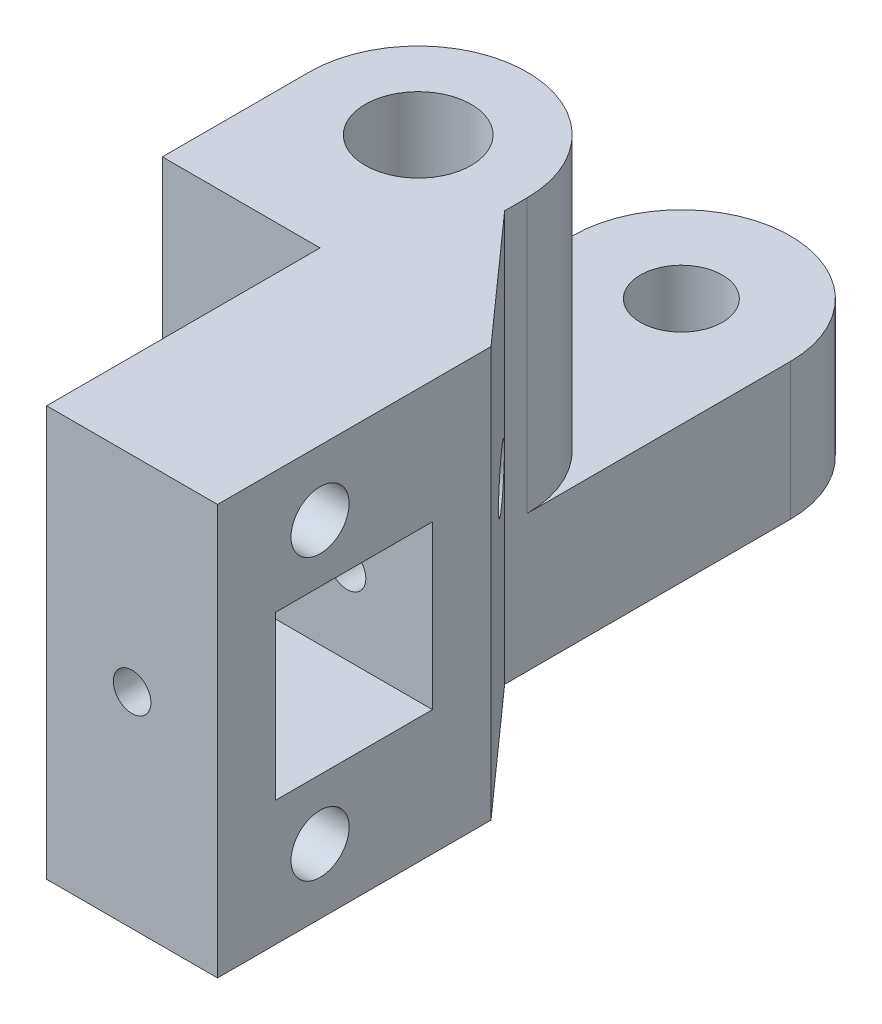
ISO-10303-21;
HEADER;
FILE_DESCRIPTION(('STEP AP214'),'2;1');
FILE_NAME('part.step','',(''),(''),'','','');
FILE_SCHEMA(('AUTOMOTIVE_DESIGN { 1 0 10303 214 1 1 1 1 }'));
ENDSEC;
DATA;
#1=APPLICATION_CONTEXT('core data for automotive mechanical design processes');
#2=APPLICATION_PROTOCOL_DEFINITION('international standard','automotive_design',2000,#1);
#3=PRODUCT_CONTEXT('',#1,'mechanical');
#4=PRODUCT('Part','Part','',(#3));
#5=PRODUCT_RELATED_PRODUCT_CATEGORY('part','',(#4));
#6=PRODUCT_DEFINITION_FORMATION('','',#4);
#7=PRODUCT_DEFINITION_CONTEXT('part definition',#1,'design');
#8=PRODUCT_DEFINITION('design','',#6,#7);
#9=PRODUCT_DEFINITION_SHAPE('','',#8);
#10=(LENGTH_UNIT() NAMED_UNIT(*) SI_UNIT(.MILLI.,.METRE.));
#11=(NAMED_UNIT(*) PLANE_ANGLE_UNIT() SI_UNIT($,.RADIAN.));
#12=(NAMED_UNIT(*) SI_UNIT($,.STERADIAN.) SOLID_ANGLE_UNIT());
#13=UNCERTAINTY_MEASURE_WITH_UNIT(LENGTH_MEASURE(1.E-05),#10,'distance_accuracy_value','');
#14=(GEOMETRIC_REPRESENTATION_CONTEXT(3) GLOBAL_UNCERTAINTY_ASSIGNED_CONTEXT((#13)) GLOBAL_UNIT_ASSIGNED_CONTEXT((#10,
#11,#12)) REPRESENTATION_CONTEXT('',''));
#15=CARTESIAN_POINT('',(0.,0.,0.));
#16=DIRECTION('',(0.,0.,1.));
#17=DIRECTION('',(1.,0.,0.));
#18=AXIS2_PLACEMENT_3D('',#15,#16,#17);
#19=CARTESIAN_POINT('',(198.249144514163,-50.,43.8148168537435));
#20=DIRECTION('',(0.,0.,-1.));
#21=DIRECTION('',(-1.,0.,0.));
#22=AXIS2_PLACEMENT_3D('',#19,#20,#21);
#23=PLANE('',#22);
#24=DIRECTION('',(0.,-1.,0.));
#25=VECTOR('',#24,1.);
#26=CARTESIAN_POINT('',(189.459181509734,60.,43.8148168537436));
#27=LINE('',#26,#25);
#28=CARTESIAN_POINT('',(189.459181509734,60.,43.8148168537435));
#29=VERTEX_POINT('',#28);
#30=CARTESIAN_POINT('',(189.459181509734,0.,43.8148168537436));
#31=VERTEX_POINT('',#30);
#32=EDGE_CURVE('E185',#29,#31,#27,.T.);
#33=ORIENTED_EDGE('',*,*,#32,.F.);
#34=DIRECTION('',(-1.,0.,0.));
#35=VECTOR('',#34,1.);
#36=CARTESIAN_POINT('',(198.249144514163,60.,43.8148168537435));
#37=LINE('',#36,#35);
#38=CARTESIAN_POINT('',(166.38327549447,60.,43.8148168537435));
#39=VERTEX_POINT('',#38);
#40=EDGE_CURVE('E212',#29,#39,#37,.T.);
#41=ORIENTED_EDGE('',*,*,#40,.T.);
#42=DIRECTION('',(0.,1.,0.));
#43=VECTOR('',#42,1.);
#44=CARTESIAN_POINT('',(166.38327549447,-50.,43.8148168537435));
#45=LINE('',#44,#43);
#46=CARTESIAN_POINT('',(166.38327549447,0.,43.8148168537435));
#47=VERTEX_POINT('',#46);
#48=EDGE_CURVE('E214',#47,#39,#45,.T.);
#49=ORIENTED_EDGE('',*,*,#48,.F.);
#50=DIRECTION('',(1.,0.,0.));
#51=VECTOR('',#50,1.);
#52=CARTESIAN_POINT('',(182.316210004317,0.,43.8148168537435));
#53=LINE('',#52,#51);
#54=EDGE_CURVE('E217',#47,#31,#53,.T.);
#55=ORIENTED_EDGE('',*,*,#54,.T.);
#56=EDGE_LOOP('',(#33,#41,#49,#55));
#57=FACE_BOUND('',#56,.T.);
#58=ADVANCED_FACE('F35',(#57),#23,.F.);
#59=CARTESIAN_POINT('',(166.38327549447,60.,83.8148168537435));
#60=DIRECTION('',(1.,0.,0.));
#61=DIRECTION('',(0.,0.,1.));
#62=AXIS2_PLACEMENT_3D('',#59,#60,#61);
#63=PLANE('',#62);
#64=DIRECTION('',(0.,0.,-1.));
#65=VECTOR('',#64,1.);
#66=CARTESIAN_POINT('',(166.38327549447,0.,83.8148168537435));
#67=LINE('',#66,#65);
#68=CARTESIAN_POINT('',(166.38327549447,0.,-16.1851831462565));
#69=VERTEX_POINT('',#68);
#70=EDGE_CURVE('E253',#47,#69,#67,.T.);
#71=ORIENTED_EDGE('',*,*,#70,.F.);
#72=ORIENTED_EDGE('',*,*,#48,.T.);
#73=DIRECTION('',(0.,0.,-1.));
#74=VECTOR('',#73,1.);
#75=CARTESIAN_POINT('',(166.38327549447,60.,83.8148168537435));
#76=LINE('',#75,#74);
#77=CARTESIAN_POINT('',(166.38327549447,60.,22.3148168537435));
#78=VERTEX_POINT('',#77);
#79=EDGE_CURVE('E252',#39,#78,#76,.T.);
#80=ORIENTED_EDGE('',*,*,#79,.T.);
#81=DIRECTION('',(0.,1.,0.));
#82=VECTOR('',#81,1.);
#83=CARTESIAN_POINT('',(166.38327549447,20.,22.3148168537435));
#84=LINE('',#83,#82);
#85=CARTESIAN_POINT('',(166.38327549447,20.,22.3148168537435));
#86=VERTEX_POINT('',#85);
#87=EDGE_CURVE('E231',#86,#78,#84,.T.);
#88=ORIENTED_EDGE('',*,*,#87,.F.);
#89=DIRECTION('',(0.,0.,-1.));
#90=VECTOR('',#89,1.);
#91=CARTESIAN_POINT('',(166.38327549447,20.,-16.1851831462565));
#92=LINE('',#91,#90);
#93=CARTESIAN_POINT('',(166.38327549447,20.,-16.1851831462565));
#94=VERTEX_POINT('',#93);
#95=EDGE_CURVE('E225',#86,#94,#92,.T.);
#96=ORIENTED_EDGE('',*,*,#95,.T.);
#97=DIRECTION('',(0.,-1.,0.));
#98=VECTOR('',#97,1.);
#99=CARTESIAN_POINT('',(166.38327549447,60.,-16.1851831462565));
#100=LINE('',#99,#98);
#101=EDGE_CURVE('E44',#94,#69,#100,.T.);
#102=ORIENTED_EDGE('',*,*,#101,.T.);
#103=EDGE_LOOP('',(#71,#72,#80,#88,#96,#102));
#104=FACE_BOUND('',#103,.T.);
#105=ADVANCED_FACE('F322',(#104),#63,.F.);
#106=CARTESIAN_POINT('',(182.316210004317,60.,-16.1851831462565));
#107=DIRECTION('',(0.,-1.,0.));
#108=DIRECTION('',(0.,0.,-1.));
#109=AXIS2_PLACEMENT_3D('',#106,#107,#108);
#110=CYLINDRICAL_SURFACE('',#109,15.9329345098463);
#111=CARTESIAN_POINT('',(182.316210004317,20.,-16.1851831462565));
#112=DIRECTION('',(0.,-1.,0.));
#113=DIRECTION('',(0.,0.,1.));
#114=AXIS2_PLACEMENT_3D('',#111,#112,#113);
#115=CIRCLE('',#114,15.9329345098463);
#116=CARTESIAN_POINT('',(198.249144514163,20.,-16.1851831462565));
#117=VERTEX_POINT('',#116);
#118=EDGE_CURVE('E234',#94,#117,#115,.T.);
#119=ORIENTED_EDGE('',*,*,#118,.T.);
#120=DIRECTION('',(0.,-1.,0.));
#121=VECTOR('',#120,1.);
#122=CARTESIAN_POINT('',(198.249144514163,60.,-16.1851831462565));
#123=LINE('',#122,#121);
#124=CARTESIAN_POINT('',(198.249144514163,0.,-16.1851831462565));
#125=VERTEX_POINT('',#124);
#126=EDGE_CURVE('E11',#117,#125,#123,.T.);
#127=ORIENTED_EDGE('',*,*,#126,.T.);
#128=CARTESIAN_POINT('',(182.316210004317,0.,-16.1851831462565));
#129=DIRECTION('',(0.,-1.,0.));
#130=DIRECTION('',(0.,0.,-1.));
#131=AXIS2_PLACEMENT_3D('',#128,#129,#130);
#132=CIRCLE('',#131,15.9329345098463);
#133=EDGE_CURVE('E248',#69,#125,#132,.T.);
#134=ORIENTED_EDGE('',*,*,#133,.F.);
#135=ORIENTED_EDGE('',*,*,#101,.F.);
#136=EDGE_LOOP('',(#119,#127,#134,#135));
#137=FACE_BOUND('',#136,.T.);
#138=ADVANCED_FACE('F37',(#137),#110,.T.);
#139=CARTESIAN_POINT('',(182.316210004317,60.,-16.1851831462565));
#140=DIRECTION('',(0.,-1.,0.));
#141=DIRECTION('',(0.,0.,-1.));
#142=AXIS2_PLACEMENT_3D('',#139,#140,#141);
#143=CYLINDRICAL_SURFACE('',#142,6.);
#144=CARTESIAN_POINT('',(182.316210004317,0.,-16.1851831462565));
#145=DIRECTION('',(0.,-1.,0.));
#146=DIRECTION('',(0.,0.,1.));
#147=AXIS2_PLACEMENT_3D('',#144,#145,#146);
#148=CIRCLE('',#147,6.);
#149=CARTESIAN_POINT('',(182.316210004317,0.,-10.1851831462565));
#150=VERTEX_POINT('',#149);
#151=EDGE_CURVE('E242',#150,#150,#148,.T.);
#152=ORIENTED_EDGE('',*,*,#151,.T.);
#153=EDGE_LOOP('',(#152));
#154=FACE_BOUND('',#153,.T.);
#155=CARTESIAN_POINT('',(182.316210004317,20.,-16.1851831462565));
#156=DIRECTION('',(0.,-1.,0.));
#157=DIRECTION('',(0.,0.,1.));
#158=AXIS2_PLACEMENT_3D('',#155,#156,#157);
#159=CIRCLE('',#158,6.);
#160=CARTESIAN_POINT('',(182.316210004317,20.,-10.1851831462565));
#161=VERTEX_POINT('',#160);
#162=EDGE_CURVE('E238',#161,#161,#159,.T.);
#163=ORIENTED_EDGE('',*,*,#162,.F.);
#164=EDGE_LOOP('',(#163));
#165=FACE_BOUND('',#164,.T.);
#166=ADVANCED_FACE('F347',(#154,#165),#143,.F.);
#167=CARTESIAN_POINT('',(182.316210004317,60.,-16.1851831462565));
#168=DIRECTION('',(0.,-1.,0.));
#169=DIRECTION('',(0.,0.,-1.));
#170=AXIS2_PLACEMENT_3D('',#167,#168,#169);
#171=PLANE('',#170);
#172=ORIENTED_EDGE('',*,*,#79,.F.);
#173=ORIENTED_EDGE('',*,*,#40,.F.);
#174=DIRECTION('',(0.,0.,-1.));
#175=VECTOR('',#174,1.);
#176=CARTESIAN_POINT('',(189.459181509734,60.,83.8148168537436));
#177=LINE('',#176,#175);
#178=CARTESIAN_POINT('',(189.459181509734,60.,83.8148168537436));
#179=VERTEX_POINT('',#178);
#180=EDGE_CURVE('E196',#179,#29,#177,.T.);
#181=ORIENTED_EDGE('',*,*,#180,.F.);
#182=DIRECTION('',(-1.,0.,0.));
#183=VECTOR('',#182,1.);
#184=CARTESIAN_POINT('',(189.459181509734,60.,83.8148168537436));
#185=LINE('',#184,#183);
#186=CARTESIAN_POINT('',(214.459181509734,60.,83.8148168537436));
#187=VERTEX_POINT('',#186);
#188=EDGE_CURVE('E194',#187,#179,#185,.T.);
#189=ORIENTED_EDGE('',*,*,#188,.F.);
#190=DIRECTION('',(0.,0.,-1.));
#191=VECTOR('',#190,1.);
#192=CARTESIAN_POINT('',(214.459181509734,60.,83.8148168537436));
#193=LINE('',#192,#191);
#194=CARTESIAN_POINT('',(214.459181509734,60.,43.8148168537436));
#195=VERTEX_POINT('',#194);
#196=EDGE_CURVE('E203',#187,#195,#193,.T.);
#197=ORIENTED_EDGE('',*,*,#196,.T.);
#198=DIRECTION('',(-0.664899161094069,0.,-0.746933133269908));
#199=VECTOR('',#198,1.);
#200=CARTESIAN_POINT('',(198.249144514163,60.,25.6048168537435));
#201=LINE('',#200,#199);
#202=CARTESIAN_POINT('',(198.249144514163,60.,25.6048168537435));
#203=VERTEX_POINT('',#202);
#204=EDGE_CURVE('E175',#195,#203,#201,.T.);
#205=ORIENTED_EDGE('',*,*,#204,.T.);
#206=DIRECTION('',(0.,0.,1.));
#207=VECTOR('',#206,1.);
#208=CARTESIAN_POINT('',(198.249144514163,60.,-16.1851831462565));
#209=LINE('',#208,#207);
#210=CARTESIAN_POINT('',(198.249144514163,60.,22.3148168537435));
#211=VERTEX_POINT('',#210);
#212=EDGE_CURVE('E249',#211,#203,#209,.T.);
#213=ORIENTED_EDGE('',*,*,#212,.F.);
#214=CARTESIAN_POINT('',(182.316210004317,60.,22.3148168537435));
#215=DIRECTION('',(0.,1.,0.));
#216=DIRECTION('',(0.,0.,1.));
#217=AXIS2_PLACEMENT_3D('',#214,#215,#216);
#218=CIRCLE('',#217,15.9329345098463);
#219=EDGE_CURVE('E219',#211,#78,#218,.T.);
#220=ORIENTED_EDGE('',*,*,#219,.T.);
#221=EDGE_LOOP('',(#172,#173,#181,#189,#197,#205,#213,#220));
#222=FACE_BOUND('',#221,.T.);
#223=CARTESIAN_POINT('',(182.316210004317,60.,22.3148168537435));
#224=DIRECTION('',(0.,-1.,0.));
#225=DIRECTION('',(0.,0.,1.));
#226=AXIS2_PLACEMENT_3D('',#223,#224,#225);
#227=CIRCLE('',#226,7.75);
#228=CARTESIAN_POINT('',(182.316210004317,60.,30.0648168537435));
#229=VERTEX_POINT('',#228);
#230=EDGE_CURVE('E239',#229,#229,#227,.T.);
#231=ORIENTED_EDGE('',*,*,#230,.T.);
#232=EDGE_LOOP('',(#231));
#233=FACE_BOUND('',#232,.T.);
#234=ADVANCED_FACE('F314',(#222,#233),#171,.F.);
#235=CARTESIAN_POINT('',(182.316210004317,0.,-16.1851831462565));
#236=DIRECTION('',(0.,-1.,0.));
#237=DIRECTION('',(0.,0.,-1.));
#238=AXIS2_PLACEMENT_3D('',#235,#236,#237);
#239=PLANE('',#238);
#240=ORIENTED_EDGE('',*,*,#54,.F.);
#241=ORIENTED_EDGE('',*,*,#70,.T.);
#242=ORIENTED_EDGE('',*,*,#133,.T.);
#243=DIRECTION('',(0.,0.,1.));
#244=VECTOR('',#243,1.);
#245=CARTESIAN_POINT('',(198.249144514163,0.,-16.1851831462565));
#246=LINE('',#245,#244);
#247=CARTESIAN_POINT('',(198.249144514163,0.,25.6048168537435));
#248=VERTEX_POINT('',#247);
#249=EDGE_CURVE('E257',#125,#248,#246,.T.);
#250=ORIENTED_EDGE('',*,*,#249,.T.);
#251=DIRECTION('',(-0.664899161094069,0.,-0.746933133269908));
#252=VECTOR('',#251,1.);
#253=CARTESIAN_POINT('',(198.249144514163,0.,25.6048168537435));
#254=LINE('',#253,#252);
#255=CARTESIAN_POINT('',(214.459181509734,0.,43.8148168537436));
#256=VERTEX_POINT('',#255);
#257=EDGE_CURVE('E179',#256,#248,#254,.T.);
#258=ORIENTED_EDGE('',*,*,#257,.F.);
#259=DIRECTION('',(0.,0.,-1.));
#260=VECTOR('',#259,1.);
#261=CARTESIAN_POINT('',(214.459181509734,0.,83.8148168537436));
#262=LINE('',#261,#260);
#263=CARTESIAN_POINT('',(214.459181509734,0.,83.8148168537436));
#264=VERTEX_POINT('',#263);
#265=EDGE_CURVE('E206',#264,#256,#262,.T.);
#266=ORIENTED_EDGE('',*,*,#265,.F.);
#267=DIRECTION('',(1.,0.,0.));
#268=VECTOR('',#267,1.);
#269=CARTESIAN_POINT('',(189.459181509734,0.,83.8148168537436));
#270=LINE('',#269,#268);
#271=CARTESIAN_POINT('',(189.459181509734,0.,83.8148168537436));
#272=VERTEX_POINT('',#271);
#273=EDGE_CURVE('E189',#272,#264,#270,.T.);
#274=ORIENTED_EDGE('',*,*,#273,.F.);
#275=DIRECTION('',(0.,0.,-1.));
#276=VECTOR('',#275,1.);
#277=CARTESIAN_POINT('',(189.459181509734,0.,83.8148168537436));
#278=LINE('',#277,#276);
#279=EDGE_CURVE('E209',#272,#31,#278,.T.);
#280=ORIENTED_EDGE('',*,*,#279,.T.);
#281=EDGE_LOOP('',(#240,#241,#242,#250,#258,#266,#274,#280));
#282=FACE_BOUND('',#281,.T.);
#283=ORIENTED_EDGE('',*,*,#151,.F.);
#284=EDGE_LOOP('',(#283));
#285=FACE_BOUND('',#284,.T.);
#286=CARTESIAN_POINT('',(182.316210004317,0.,22.3148168537435));
#287=DIRECTION('',(0.,-1.,0.));
#288=DIRECTION('',(0.,0.,1.));
#289=AXIS2_PLACEMENT_3D('',#286,#287,#288);
#290=CIRCLE('',#289,7.75);
#291=CARTESIAN_POINT('',(182.316210004317,0.,30.0648168537435));
#292=VERTEX_POINT('',#291);
#293=EDGE_CURVE('E243',#292,#292,#290,.T.);
#294=ORIENTED_EDGE('',*,*,#293,.F.);
#295=EDGE_LOOP('',(#294));
#296=FACE_BOUND('',#295,.T.);
#297=ADVANCED_FACE('F324',(#282,#285,#296),#239,.T.);
#298=CARTESIAN_POINT('',(198.249144514163,60.,-16.1851831462565));
#299=DIRECTION('',(-1.,0.,0.));
#300=DIRECTION('',(0.,0.,-1.));
#301=AXIS2_PLACEMENT_3D('',#298,#299,#300);
#302=PLANE('',#301);
#303=ORIENTED_EDGE('',*,*,#212,.T.);
#304=DIRECTION('',(0.,1.,0.));
#305=VECTOR('',#304,1.);
#306=CARTESIAN_POINT('',(198.249144514163,0.,25.6048168537435));
#307=LINE('',#306,#305);
#308=EDGE_CURVE('E181',#248,#203,#307,.T.);
#309=ORIENTED_EDGE('',*,*,#308,.F.);
#310=ORIENTED_EDGE('',*,*,#249,.F.);
#311=ORIENTED_EDGE('',*,*,#126,.F.);
#312=DIRECTION('',(0.,0.,1.));
#313=VECTOR('',#312,1.);
#314=CARTESIAN_POINT('',(198.249144514163,20.,-16.1851831462565));
#315=LINE('',#314,#313);
#316=CARTESIAN_POINT('',(198.249144514163,20.,22.3148168537435));
#317=VERTEX_POINT('',#316);
#318=EDGE_CURVE('E220',#117,#317,#315,.T.);
#319=ORIENTED_EDGE('',*,*,#318,.T.);
#320=DIRECTION('',(0.,1.,0.));
#321=VECTOR('',#320,1.);
#322=CARTESIAN_POINT('',(198.249144514163,20.,22.3148168537435));
#323=LINE('',#322,#321);
#324=EDGE_CURVE('E228',#317,#211,#323,.T.);
#325=ORIENTED_EDGE('',*,*,#324,.T.);
#326=EDGE_LOOP('',(#303,#309,#310,#311,#319,#325));
#327=FACE_BOUND('',#326,.T.);
#328=ADVANCED_FACE('F338',(#327),#302,.F.);
#329=CARTESIAN_POINT('',(182.316210004317,60.,22.3148168537435));
#330=DIRECTION('',(0.,-1.,0.));
#331=DIRECTION('',(0.,0.,-1.));
#332=AXIS2_PLACEMENT_3D('',#329,#330,#331);
#333=CYLINDRICAL_SURFACE('',#332,7.75);
#334=ORIENTED_EDGE('',*,*,#230,.F.);
#335=EDGE_LOOP('',(#334));
#336=FACE_BOUND('',#335,.T.);
#337=ORIENTED_EDGE('',*,*,#293,.T.);
#338=EDGE_LOOP('',(#337));
#339=FACE_BOUND('',#338,.T.);
#340=ADVANCED_FACE('F365',(#336,#339),#333,.F.);
#341=CARTESIAN_POINT('',(182.316210004317,20.,-16.1851831462565));
#342=DIRECTION('',(0.,1.,0.));
#343=DIRECTION('',(0.,0.,1.));
#344=AXIS2_PLACEMENT_3D('',#341,#342,#343);
#345=PLANE('',#344);
#346=ORIENTED_EDGE('',*,*,#162,.T.);
#347=EDGE_LOOP('',(#346));
#348=FACE_BOUND('',#347,.T.);
#349=ORIENTED_EDGE('',*,*,#118,.F.);
#350=ORIENTED_EDGE('',*,*,#95,.F.);
#351=CARTESIAN_POINT('',(182.316210004317,20.,22.3148168537435));
#352=DIRECTION('',(0.,1.,0.));
#353=DIRECTION('',(0.,0.,1.));
#354=AXIS2_PLACEMENT_3D('',#351,#352,#353);
#355=CIRCLE('',#354,15.9329345098463);
#356=EDGE_CURVE('E223',#317,#86,#355,.T.);
#357=ORIENTED_EDGE('',*,*,#356,.F.);
#358=ORIENTED_EDGE('',*,*,#318,.F.);
#359=EDGE_LOOP('',(#349,#350,#357,#358));
#360=FACE_BOUND('',#359,.T.);
#361=ADVANCED_FACE('F343',(#348,#360),#345,.T.);
#362=CARTESIAN_POINT('',(182.316210004317,20.,22.3148168537435));
#363=DIRECTION('',(0.,1.,0.));
#364=DIRECTION('',(0.,0.,1.));
#365=AXIS2_PLACEMENT_3D('',#362,#363,#364);
#366=CYLINDRICAL_SURFACE('',#365,15.9329345098463);
#367=ORIENTED_EDGE('',*,*,#219,.F.);
#368=ORIENTED_EDGE('',*,*,#324,.F.);
#369=ORIENTED_EDGE('',*,*,#356,.T.);
#370=ORIENTED_EDGE('',*,*,#87,.T.);
#371=EDGE_LOOP('',(#367,#368,#369,#370));
#372=FACE_BOUND('',#371,.T.);
#373=ADVANCED_FACE('F300',(#372),#366,.T.);
#374=CARTESIAN_POINT('',(189.459181509734,60.,83.8148168537436));
#375=DIRECTION('',(1.,0.,0.));
#376=DIRECTION('',(0.,0.,-1.));
#377=AXIS2_PLACEMENT_3D('',#374,#375,#376);
#378=PLANE('',#377);
#379=CARTESIAN_POINT('',(189.459181509734,50.5000000000053,68.8148168537502));
#380=DIRECTION('',(-1.,0.,0.));
#381=DIRECTION('',(0.,0.,1.));
#382=AXIS2_PLACEMENT_3D('',#379,#380,#381);
#383=CIRCLE('',#382,4.25000000002009);
#384=CARTESIAN_POINT('',(189.459181509734,50.5000000000053,73.0648168537703));
#385=VERTEX_POINT('',#384);
#386=EDGE_CURVE('E162',#385,#385,#383,.T.);
#387=ORIENTED_EDGE('',*,*,#386,.F.);
#388=EDGE_LOOP('',(#387));
#389=FACE_BOUND('',#388,.T.);
#390=CARTESIAN_POINT('',(189.459181509734,9.50000000000533,68.8148168537502));
#391=DIRECTION('',(-1.,0.,0.));
#392=DIRECTION('',(0.,0.,1.));
#393=AXIS2_PLACEMENT_3D('',#390,#391,#392);
#394=CIRCLE('',#393,4.25000000002008);
#395=CARTESIAN_POINT('',(189.459181509734,9.50000000000533,73.0648168537703));
#396=VERTEX_POINT('',#395);
#397=EDGE_CURVE('E286',#396,#396,#394,.T.);
#398=ORIENTED_EDGE('',*,*,#397,.F.);
#399=EDGE_LOOP('',(#398));
#400=FACE_BOUND('',#399,.T.);
#401=DIRECTION('',(0.,0.,-1.));
#402=VECTOR('',#401,1.);
#403=CARTESIAN_POINT('',(189.459181509734,42.0910814196856,52.3711885401098));
#404=LINE('',#403,#402);
#405=CARTESIAN_POINT('',(189.459181509734,42.0910814196856,75.3711885401098));
#406=VERTEX_POINT('',#405);
#407=CARTESIAN_POINT('',(189.459181509734,42.0910814196856,52.3711885401098));
#408=VERTEX_POINT('',#407);
#409=EDGE_CURVE('E168',#406,#408,#404,.T.);
#410=ORIENTED_EDGE('',*,*,#409,.F.);
#411=DIRECTION('',(0.,1.,0.));
#412=VECTOR('',#411,1.);
#413=CARTESIAN_POINT('',(189.459181509734,42.0910814196856,75.3711885401098));
#414=LINE('',#413,#412);
#415=CARTESIAN_POINT('',(189.459181509734,18.2787081081669,75.3711885401098));
#416=VERTEX_POINT('',#415);
#417=EDGE_CURVE('E52',#416,#406,#414,.T.);
#418=ORIENTED_EDGE('',*,*,#417,.F.);
#419=DIRECTION('',(0.,0.,1.));
#420=VECTOR('',#419,1.);
#421=CARTESIAN_POINT('',(189.459181509734,18.2787081081669,52.3711885401098));
#422=LINE('',#421,#420);
#423=CARTESIAN_POINT('',(189.459181509734,18.2787081081669,52.3711885401098));
#424=VERTEX_POINT('',#423);
#425=EDGE_CURVE('E156',#424,#416,#422,.T.);
#426=ORIENTED_EDGE('',*,*,#425,.F.);
#427=DIRECTION('',(0.,-1.,0.));
#428=VECTOR('',#427,1.);
#429=CARTESIAN_POINT('',(189.459181509734,42.0910814196856,52.3711885401098));
#430=LINE('',#429,#428);
#431=EDGE_CURVE('E159',#408,#424,#430,.T.);
#432=ORIENTED_EDGE('',*,*,#431,.F.);
#433=EDGE_LOOP('',(#410,#418,#426,#432));
#434=FACE_BOUND('',#433,.T.);
#435=ORIENTED_EDGE('',*,*,#32,.T.);
#436=ORIENTED_EDGE('',*,*,#279,.F.);
#437=DIRECTION('',(0.,-1.,0.));
#438=VECTOR('',#437,1.);
#439=CARTESIAN_POINT('',(189.459181509734,60.,83.8148168537436));
#440=LINE('',#439,#438);
#441=EDGE_CURVE('E186',#179,#272,#440,.T.);
#442=ORIENTED_EDGE('',*,*,#441,.F.);
#443=ORIENTED_EDGE('',*,*,#180,.T.);
#444=EDGE_LOOP('',(#435,#436,#442,#443));
#445=FACE_BOUND('',#444,.T.);
#446=ADVANCED_FACE('F297',(#389,#400,#434,#445),#378,.F.);
#447=CARTESIAN_POINT('',(214.459181509734,60.,83.8148168537436));
#448=DIRECTION('',(-1.,0.,0.));
#449=DIRECTION('',(0.,0.,1.));
#450=AXIS2_PLACEMENT_3D('',#447,#448,#449);
#451=PLANE('',#450);
#452=CARTESIAN_POINT('',(214.459181509734,50.5000000000053,68.8148168537502));
#453=DIRECTION('',(-1.,0.,0.));
#454=DIRECTION('',(0.,0.,1.));
#455=AXIS2_PLACEMENT_3D('',#452,#453,#454);
#456=CIRCLE('',#455,4.25000000002009);
#457=CARTESIAN_POINT('',(214.459181509734,50.5000000000053,73.0648168537703));
#458=VERTEX_POINT('',#457);
#459=EDGE_CURVE('E288',#458,#458,#456,.T.);
#460=ORIENTED_EDGE('',*,*,#459,.T.);
#461=EDGE_LOOP('',(#460));
#462=FACE_BOUND('',#461,.T.);
#463=CARTESIAN_POINT('',(214.459181509734,9.50000000000533,68.8148168537502));
#464=DIRECTION('',(-1.,0.,0.));
#465=DIRECTION('',(0.,0.,1.));
#466=AXIS2_PLACEMENT_3D('',#463,#464,#465);
#467=CIRCLE('',#466,4.25000000002008);
#468=CARTESIAN_POINT('',(214.459181509734,9.50000000000533,73.0648168537703));
#469=VERTEX_POINT('',#468);
#470=EDGE_CURVE('E169',#469,#469,#467,.T.);
#471=ORIENTED_EDGE('',*,*,#470,.T.);
#472=EDGE_LOOP('',(#471));
#473=FACE_BOUND('',#472,.T.);
#474=DIRECTION('',(0.,0.,1.));
#475=VECTOR('',#474,1.);
#476=CARTESIAN_POINT('',(214.459181509734,18.2787081081669,52.3711885401098));
#477=LINE('',#476,#475);
#478=CARTESIAN_POINT('',(214.459181509734,18.2787081081669,52.3711885401098));
#479=VERTEX_POINT('',#478);
#480=CARTESIAN_POINT('',(214.459181509734,18.2787081081669,75.3711885401098));
#481=VERTEX_POINT('',#480);
#482=EDGE_CURVE('E146',#479,#481,#477,.T.);
#483=ORIENTED_EDGE('',*,*,#482,.T.);
#484=DIRECTION('',(0.,1.,0.));
#485=VECTOR('',#484,1.);
#486=CARTESIAN_POINT('',(214.459181509734,42.0910814196856,75.3711885401098));
#487=LINE('',#486,#485);
#488=CARTESIAN_POINT('',(214.459181509734,42.0910814196856,75.3711885401098));
#489=VERTEX_POINT('',#488);
#490=EDGE_CURVE('E140',#481,#489,#487,.T.);
#491=ORIENTED_EDGE('',*,*,#490,.T.);
#492=DIRECTION('',(0.,0.,-1.));
#493=VECTOR('',#492,1.);
#494=CARTESIAN_POINT('',(214.459181509734,42.0910814196856,52.3711885401098));
#495=LINE('',#494,#493);
#496=CARTESIAN_POINT('',(214.459181509734,42.0910814196856,52.3711885401098));
#497=VERTEX_POINT('',#496);
#498=EDGE_CURVE('E149',#489,#497,#495,.T.);
#499=ORIENTED_EDGE('',*,*,#498,.T.);
#500=DIRECTION('',(0.,-1.,0.));
#501=VECTOR('',#500,1.);
#502=CARTESIAN_POINT('',(214.459181509734,42.0910814196856,52.3711885401098));
#503=LINE('',#502,#501);
#504=EDGE_CURVE('E60',#497,#479,#503,.T.);
#505=ORIENTED_EDGE('',*,*,#504,.T.);
#506=EDGE_LOOP('',(#483,#491,#499,#505));
#507=FACE_BOUND('',#506,.T.);
#508=DIRECTION('',(0.,1.,0.));
#509=VECTOR('',#508,1.);
#510=CARTESIAN_POINT('',(214.459181509734,60.,43.8148168537436));
#511=LINE('',#510,#509);
#512=EDGE_CURVE('E190',#256,#195,#511,.T.);
#513=ORIENTED_EDGE('',*,*,#512,.T.);
#514=ORIENTED_EDGE('',*,*,#196,.F.);
#515=DIRECTION('',(0.,1.,0.));
#516=VECTOR('',#515,1.);
#517=CARTESIAN_POINT('',(214.459181509734,60.,83.8148168537436));
#518=LINE('',#517,#516);
#519=EDGE_CURVE('E192',#264,#187,#518,.T.);
#520=ORIENTED_EDGE('',*,*,#519,.F.);
#521=ORIENTED_EDGE('',*,*,#265,.T.);
#522=EDGE_LOOP('',(#513,#514,#520,#521));
#523=FACE_BOUND('',#522,.T.);
#524=ADVANCED_FACE('F153',(#462,#473,#507,#523),#451,.F.);
#525=CARTESIAN_POINT('',(0.,0.,83.8148168537436));
#526=DIRECTION('',(0.,0.,1.));
#527=DIRECTION('',(1.,0.,0.));
#528=AXIS2_PLACEMENT_3D('',#525,#526,#527);
#529=PLANE('',#528);
#530=CARTESIAN_POINT('',(201.959181509734,30.,83.8148168537436));
#531=DIRECTION('',(0.,0.,1.));
#532=DIRECTION('',(1.,0.,0.));
#533=AXIS2_PLACEMENT_3D('',#530,#531,#532);
#534=CIRCLE('',#533,2.75000000000001);
#535=CARTESIAN_POINT('',(204.709181509734,30.,83.8148168537436));
#536=VERTEX_POINT('',#535);
#537=EDGE_CURVE('E268',#536,#536,#534,.T.);
#538=ORIENTED_EDGE('',*,*,#537,.F.);
#539=EDGE_LOOP('',(#538));
#540=FACE_BOUND('',#539,.T.);
#541=ORIENTED_EDGE('',*,*,#441,.T.);
#542=ORIENTED_EDGE('',*,*,#273,.T.);
#543=ORIENTED_EDGE('',*,*,#519,.T.);
#544=ORIENTED_EDGE('',*,*,#188,.T.);
#545=EDGE_LOOP('',(#541,#542,#543,#544));
#546=FACE_BOUND('',#545,.T.);
#547=ADVANCED_FACE('F331',(#540,#546),#529,.T.);
#548=CARTESIAN_POINT('',(198.249144514163,0.,25.6048168537435));
#549=DIRECTION('',(0.746933133269909,0.,-0.664899161094069));
#550=DIRECTION('',(-0.664899161094069,0.,-0.746933133269909));
#551=AXIS2_PLACEMENT_3D('',#548,#549,#550);
#552=PLANE('',#551);
#553=CARTESIAN_POINT('',(201.959181509734,30.,29.772591036357));
#554=DIRECTION('',(0.746933133269909,0.,-0.664899161094069));
#555=DIRECTION('',(0.664899161094069,0.,0.746933133269909));
#556=AXIS2_PLACEMENT_3D('',#553,#554,#555);
#557=ELLIPSE('',#556,5.26395610763121,3.49999999999999);
#558=CARTESIAN_POINT('',(205.459181509734,30.,33.7044142652252));
#559=VERTEX_POINT('',#558);
#560=EDGE_CURVE('E39',#559,#559,#557,.T.);
#561=ORIENTED_EDGE('',*,*,#560,.F.);
#562=EDGE_LOOP('',(#561));
#563=FACE_BOUND('',#562,.T.);
#564=ORIENTED_EDGE('',*,*,#204,.F.);
#565=ORIENTED_EDGE('',*,*,#512,.F.);
#566=ORIENTED_EDGE('',*,*,#257,.T.);
#567=ORIENTED_EDGE('',*,*,#308,.T.);
#568=EDGE_LOOP('',(#564,#565,#566,#567));
#569=FACE_BOUND('',#568,.T.);
#570=ADVANCED_FACE('F334',(#563,#569),#552,.T.);
#571=CARTESIAN_POINT('',(214.459181509734,42.0910814196856,75.3711885401098));
#572=DIRECTION('',(0.,0.,1.));
#573=DIRECTION('',(1.,0.,0.));
#574=AXIS2_PLACEMENT_3D('',#571,#572,#573);
#575=PLANE('',#574);
#576=CARTESIAN_POINT('',(201.959181509734,30.,75.3711885401098));
#577=DIRECTION('',(0.,0.,1.));
#578=DIRECTION('',(1.,0.,0.));
#579=AXIS2_PLACEMENT_3D('',#576,#577,#578);
#580=CIRCLE('',#579,2.75000000000001);
#581=CARTESIAN_POINT('',(204.709181509734,30.,75.3711885401098));
#582=VERTEX_POINT('',#581);
#583=EDGE_CURVE('E267',#582,#582,#580,.T.);
#584=ORIENTED_EDGE('',*,*,#583,.T.);
#585=EDGE_LOOP('',(#584));
#586=FACE_BOUND('',#585,.T.);
#587=ORIENTED_EDGE('',*,*,#417,.T.);
#588=DIRECTION('',(-1.,0.,0.));
#589=VECTOR('',#588,1.);
#590=CARTESIAN_POINT('',(214.459181509734,42.0910814196856,75.3711885401098));
#591=LINE('',#590,#589);
#592=EDGE_CURVE('E136',#489,#406,#591,.T.);
#593=ORIENTED_EDGE('',*,*,#592,.F.);
#594=ORIENTED_EDGE('',*,*,#490,.F.);
#595=DIRECTION('',(-1.,0.,0.));
#596=VECTOR('',#595,1.);
#597=CARTESIAN_POINT('',(214.459181509734,18.2787081081669,75.3711885401098));
#598=LINE('',#597,#596);
#599=EDGE_CURVE('E173',#481,#416,#598,.T.);
#600=ORIENTED_EDGE('',*,*,#599,.T.);
#601=EDGE_LOOP('',(#587,#593,#594,#600));
#602=FACE_BOUND('',#601,.T.);
#603=ADVANCED_FACE('F138',(#586,#602),#575,.F.);
#604=CARTESIAN_POINT('',(214.459181509734,18.2787081081669,52.3711885401098));
#605=DIRECTION('',(0.,-1.,0.));
#606=DIRECTION('',(0.,0.,-1.));
#607=AXIS2_PLACEMENT_3D('',#604,#605,#606);
#608=PLANE('',#607);
#609=ORIENTED_EDGE('',*,*,#425,.T.);
#610=ORIENTED_EDGE('',*,*,#599,.F.);
#611=ORIENTED_EDGE('',*,*,#482,.F.);
#612=DIRECTION('',(-1.,0.,0.));
#613=VECTOR('',#612,1.);
#614=CARTESIAN_POINT('',(214.459181509734,18.2787081081669,52.3711885401098));
#615=LINE('',#614,#613);
#616=EDGE_CURVE('E176',#479,#424,#615,.T.);
#617=ORIENTED_EDGE('',*,*,#616,.T.);
#618=EDGE_LOOP('',(#609,#610,#611,#617));
#619=FACE_BOUND('',#618,.T.);
#620=ADVANCED_FACE('F425',(#619),#608,.F.);
#621=CARTESIAN_POINT('',(214.459181509734,42.0910814196856,52.3711885401098));
#622=DIRECTION('',(0.,0.,-1.));
#623=DIRECTION('',(0.,1.,0.));
#624=AXIS2_PLACEMENT_3D('',#621,#622,#623);
#625=PLANE('',#624);
#626=CARTESIAN_POINT('',(201.959181509734,30.,52.3711885401098));
#627=DIRECTION('',(0.,0.,-1.));
#628=DIRECTION('',(0.,1.,0.));
#629=AXIS2_PLACEMENT_3D('',#626,#627,#628);
#630=CIRCLE('',#629,2.75000000000001);
#631=CARTESIAN_POINT('',(204.709181509734,30.,52.3711885401098));
#632=VERTEX_POINT('',#631);
#633=EDGE_CURVE('E265',#632,#632,#630,.T.);
#634=ORIENTED_EDGE('',*,*,#633,.T.);
#635=EDGE_LOOP('',(#634));
#636=FACE_BOUND('',#635,.T.);
#637=ORIENTED_EDGE('',*,*,#431,.T.);
#638=ORIENTED_EDGE('',*,*,#616,.F.);
#639=ORIENTED_EDGE('',*,*,#504,.F.);
#640=DIRECTION('',(-1.,0.,0.));
#641=VECTOR('',#640,1.);
#642=CARTESIAN_POINT('',(214.459181509734,42.0910814196856,52.3711885401098));
#643=LINE('',#642,#641);
#644=EDGE_CURVE('E145',#497,#408,#643,.T.);
#645=ORIENTED_EDGE('',*,*,#644,.T.);
#646=EDGE_LOOP('',(#637,#638,#639,#645));
#647=FACE_BOUND('',#646,.T.);
#648=ADVANCED_FACE('F433',(#636,#647),#625,.F.);
#649=CARTESIAN_POINT('',(214.459181509734,42.0910814196856,52.3711885401098));
#650=DIRECTION('',(0.,1.,0.));
#651=DIRECTION('',(0.,0.,1.));
#652=AXIS2_PLACEMENT_3D('',#649,#650,#651);
#653=PLANE('',#652);
#654=ORIENTED_EDGE('',*,*,#409,.T.);
#655=ORIENTED_EDGE('',*,*,#644,.F.);
#656=ORIENTED_EDGE('',*,*,#498,.F.);
#657=ORIENTED_EDGE('',*,*,#592,.T.);
#658=EDGE_LOOP('',(#654,#655,#656,#657));
#659=FACE_BOUND('',#658,.T.);
#660=ADVANCED_FACE('F150',(#659),#653,.F.);
#661=CARTESIAN_POINT('',(214.459181509734,9.50000000000533,68.8148168537502));
#662=DIRECTION('',(-1.,0.,0.));
#663=DIRECTION('',(0.,0.,1.));
#664=AXIS2_PLACEMENT_3D('',#661,#662,#663);
#665=CYLINDRICAL_SURFACE('',#664,4.25000000002008);
#666=ORIENTED_EDGE('',*,*,#470,.F.);
#667=EDGE_LOOP('',(#666));
#668=FACE_BOUND('',#667,.T.);
#669=ORIENTED_EDGE('',*,*,#397,.T.);
#670=EDGE_LOOP('',(#669));
#671=FACE_BOUND('',#670,.T.);
#672=ADVANCED_FACE('F447',(#668,#671),#665,.F.);
#673=CARTESIAN_POINT('',(214.459181509734,50.5000000000053,68.8148168537502));
#674=DIRECTION('',(-1.,0.,0.));
#675=DIRECTION('',(0.,0.,1.));
#676=AXIS2_PLACEMENT_3D('',#673,#674,#675);
#677=CYLINDRICAL_SURFACE('',#676,4.25000000002009);
#678=ORIENTED_EDGE('',*,*,#459,.F.);
#679=EDGE_LOOP('',(#678));
#680=FACE_BOUND('',#679,.T.);
#681=ORIENTED_EDGE('',*,*,#386,.T.);
#682=EDGE_LOOP('',(#681));
#683=FACE_BOUND('',#682,.T.);
#684=ADVANCED_FACE('F295',(#680,#683),#677,.F.);
#685=CARTESIAN_POINT('',(201.959181509734,30.,-32.1181176561028));
#686=DIRECTION('',(0.,0.,1.));
#687=DIRECTION('',(1.,0.,0.));
#688=AXIS2_PLACEMENT_3D('',#685,#686,#687);
#689=CYLINDRICAL_SURFACE('',#688,2.75000000000001);
#690=CARTESIAN_POINT('',(201.959181509734,30.,34.3711885401098));
#691=DIRECTION('',(0.,0.,1.));
#692=DIRECTION('',(1.,0.,0.));
#693=AXIS2_PLACEMENT_3D('',#690,#691,#692);
#694=CIRCLE('',#693,2.75000000000001);
#695=CARTESIAN_POINT('',(204.709181509734,30.,34.3711885401098));
#696=VERTEX_POINT('',#695);
#697=EDGE_CURVE('E269',#696,#696,#694,.F.);
#698=CARTESIAN_POINT('',(204.709181509734,30.,34.3711885401098));
#699=CARTESIAN_POINT('',(204.709181509734,30.,34.5586885401098));
#700=CARTESIAN_POINT('',(204.709181509734,30.,34.7461885401098));
#701=CARTESIAN_POINT('',(204.709181509734,30.,35.1211885401098));
#702=CARTESIAN_POINT('',(204.709181509734,30.,35.3086885401098));
#703=CARTESIAN_POINT('',(204.709181509734,30.,35.6836885401098));
#704=CARTESIAN_POINT('',(204.709181509734,30.,35.8711885401098));
#705=CARTESIAN_POINT('',(204.709181509734,30.,36.2461885401098));
#706=CARTESIAN_POINT('',(204.709181509734,30.,36.4336885401098));
#707=CARTESIAN_POINT('',(204.709181509734,30.,36.8086885401098));
#708=CARTESIAN_POINT('',(204.709181509734,30.,36.9961885401098));
#709=CARTESIAN_POINT('',(204.709181509734,30.,37.3711885401098));
#710=CARTESIAN_POINT('',(204.709181509734,30.,37.5586885401098));
#711=CARTESIAN_POINT('',(204.709181509734,30.,37.9336885401098));
#712=CARTESIAN_POINT('',(204.709181509734,30.,38.1211885401098));
#713=CARTESIAN_POINT('',(204.709181509734,30.,38.4961885401098));
#714=CARTESIAN_POINT('',(204.709181509734,30.,38.6836885401098));
#715=CARTESIAN_POINT('',(204.709181509734,30.,39.0586885401098));
#716=CARTESIAN_POINT('',(204.709181509734,30.,39.2461885401098));
#717=CARTESIAN_POINT('',(204.709181509734,30.,39.6211885401098));
#718=CARTESIAN_POINT('',(204.709181509734,30.,39.8086885401098));
#719=CARTESIAN_POINT('',(204.709181509734,30.,40.1836885401098));
#720=CARTESIAN_POINT('',(204.709181509734,30.,40.3711885401098));
#721=CARTESIAN_POINT('',(204.709181509734,30.,40.7461885401098));
#722=CARTESIAN_POINT('',(204.709181509734,30.,40.9336885401098));
#723=CARTESIAN_POINT('',(204.709181509734,30.,41.3086885401098));
#724=CARTESIAN_POINT('',(204.709181509734,30.,41.4961885401098));
#725=CARTESIAN_POINT('',(204.709181509734,30.,41.8711885401098));
#726=CARTESIAN_POINT('',(204.709181509734,30.,42.0586885401098));
#727=CARTESIAN_POINT('',(204.709181509734,30.,42.4336885401098));
#728=CARTESIAN_POINT('',(204.709181509734,30.,42.6211885401098));
#729=CARTESIAN_POINT('',(204.709181509734,30.,42.9961885401098));
#730=CARTESIAN_POINT('',(204.709181509734,30.,43.1836885401098));
#731=CARTESIAN_POINT('',(204.709181509734,30.,43.5586885401098));
#732=CARTESIAN_POINT('',(204.709181509734,30.,43.7461885401098));
#733=CARTESIAN_POINT('',(204.709181509734,30.,44.1211885401098));
#734=CARTESIAN_POINT('',(204.709181509734,30.,44.3086885401098));
#735=CARTESIAN_POINT('',(204.709181509734,30.,44.6836885401098));
#736=CARTESIAN_POINT('',(204.709181509734,30.,44.8711885401098));
#737=CARTESIAN_POINT('',(204.709181509734,30.,45.2461885401098));
#738=CARTESIAN_POINT('',(204.709181509734,30.,45.4336885401098));
#739=CARTESIAN_POINT('',(204.709181509734,30.,45.8086885401098));
#740=CARTESIAN_POINT('',(204.709181509734,30.,45.9961885401098));
#741=CARTESIAN_POINT('',(204.709181509734,30.,46.3711885401098));
#742=CARTESIAN_POINT('',(204.709181509734,30.,46.5586885401098));
#743=CARTESIAN_POINT('',(204.709181509734,30.,46.9336885401098));
#744=CARTESIAN_POINT('',(204.709181509734,30.,47.1211885401098));
#745=CARTESIAN_POINT('',(204.709181509734,30.,47.4961885401098));
#746=CARTESIAN_POINT('',(204.709181509734,30.,47.6836885401098));
#747=CARTESIAN_POINT('',(204.709181509734,30.,48.0586885401098));
#748=CARTESIAN_POINT('',(204.709181509734,30.,48.2461885401098));
#749=CARTESIAN_POINT('',(204.709181509734,30.,48.6211885401098));
#750=CARTESIAN_POINT('',(204.709181509734,30.,48.8086885401098));
#751=CARTESIAN_POINT('',(204.709181509734,30.,49.1836885401098));
#752=CARTESIAN_POINT('',(204.709181509734,30.,49.3711885401098));
#753=CARTESIAN_POINT('',(204.709181509734,30.,49.7461885401098));
#754=CARTESIAN_POINT('',(204.709181509734,30.,49.9336885401098));
#755=CARTESIAN_POINT('',(204.709181509734,30.,50.3086885401098));
#756=CARTESIAN_POINT('',(204.709181509734,30.,50.4961885401098));
#757=CARTESIAN_POINT('',(204.709181509734,30.,50.8711885401098));
#758=CARTESIAN_POINT('',(204.709181509734,30.,51.0586885401098));
#759=CARTESIAN_POINT('',(204.709181509734,30.,51.4336885401098));
#760=CARTESIAN_POINT('',(204.709181509734,30.,51.6211885401098));
#761=CARTESIAN_POINT('',(204.709181509734,30.,51.9961885401098));
#762=CARTESIAN_POINT('',(204.709181509734,30.,52.1836885401098));
#763=CARTESIAN_POINT('',(204.709181509734,30.,52.3711885401098));
#764=B_SPLINE_CURVE_WITH_KNOTS('',3,(#698,#699,#700,#701,#702,#703,#704,#705,#706,#707,#708,
#709,#710,#711,#712,#713,#714,#715,#716,#717,#718,#719,#720,#721,#722,#723,#724,#725,#726,#727,
#728,#729,#730,#731,#732,#733,#734,#735,#736,#737,#738,#739,#740,#741,#742,#743,#744,#745,#746,
#747,#748,#749,#750,#751,#752,#753,#754,#755,#756,#757,#758,#759,#760,#761,#762,#763),
.UNSPECIFIED.,.F.,.F.,(4,2,2,2,2,2,2,2,2,2,2,2,2,2,2,2,2,2,2,2,2,2,2,2,2,2,2,2,2,2,2,2,4),(0.,
0.562499999999994,1.125,1.68750000000001,2.25,2.8125,3.375,3.93750000000001,4.5,5.0625,
5.62500000000001,6.18750000000001,6.75000000000001,7.3125,7.87500000000001,8.43750000000001,
9.00000000000001,9.5625,10.125,10.6875,11.25,11.8125,12.375,12.9375,13.5,14.0625,14.625,15.1875,
15.75,16.3125,16.875,17.4375,18.),.UNSPECIFIED.);
#765=EDGE_CURVE('BSEAM460',#696,#632,#764,.T.);
#766=ORIENTED_EDGE('',*,*,#697,.T.);
#767=ORIENTED_EDGE('',*,*,#633,.F.);
#768=ORIENTED_EDGE('',*,*,#765,.T.);
#769=ORIENTED_EDGE('',*,*,#765,.F.);
#770=EDGE_LOOP('',(#766,#768,#767,#769));
#771=FACE_BOUND('',#770,.T.);
#772=ADVANCED_FACE('F460',(#771),#689,.F.);
#773=CARTESIAN_POINT('',(204.709181509734,30.,83.8148168537436));
#774=CARTESIAN_POINT('',(204.709181509734,30.,83.7268623921432));
#775=CARTESIAN_POINT('',(204.709181509734,30.,83.6389079305429));
#776=CARTESIAN_POINT('',(204.709181509734,30.,83.4629990073421));
#777=CARTESIAN_POINT('',(204.709181509734,30.,83.3750445457418));
#778=CARTESIAN_POINT('',(204.709181509734,30.,83.1991356225411));
#779=CARTESIAN_POINT('',(204.709181509734,30.,83.1111811609408));
#780=CARTESIAN_POINT('',(204.709181509734,30.,82.93527223774));
#781=CARTESIAN_POINT('',(204.709181509734,30.,82.8473177761397));
#782=CARTESIAN_POINT('',(204.709181509734,30.,82.671408852939));
#783=CARTESIAN_POINT('',(204.709181509734,30.,82.5834543913386));
#784=CARTESIAN_POINT('',(204.709181509734,30.,82.4075454681379));
#785=CARTESIAN_POINT('',(204.709181509734,30.,82.3195910065376));
#786=CARTESIAN_POINT('',(204.709181509734,30.,82.1436820833369));
#787=CARTESIAN_POINT('',(204.709181509734,30.,82.0557276217365));
#788=CARTESIAN_POINT('',(204.709181509734,30.,81.8798186985358));
#789=CARTESIAN_POINT('',(204.709181509734,30.,81.7918642369355));
#790=CARTESIAN_POINT('',(204.709181509734,30.,81.6159553137348));
#791=CARTESIAN_POINT('',(204.709181509734,30.,81.5280008521344));
#792=CARTESIAN_POINT('',(204.709181509734,30.,81.3520919289337));
#793=CARTESIAN_POINT('',(204.709181509734,30.,81.2641374673334));
#794=CARTESIAN_POINT('',(204.709181509734,30.,81.0882285441327));
#795=CARTESIAN_POINT('',(204.709181509734,30.,81.0002740825323));
#796=CARTESIAN_POINT('',(204.709181509734,30.,80.8243651593316));
#797=CARTESIAN_POINT('',(204.709181509734,30.,80.7364106977313));
#798=CARTESIAN_POINT('',(204.709181509734,30.,80.5605017745306));
#799=CARTESIAN_POINT('',(204.709181509734,30.,80.4725473129302));
#800=CARTESIAN_POINT('',(204.709181509734,30.,80.2966383897295));
#801=CARTESIAN_POINT('',(204.709181509734,30.,80.2086839281292));
#802=CARTESIAN_POINT('',(204.709181509734,30.,80.0327750049285));
#803=CARTESIAN_POINT('',(204.709181509734,30.,79.9448205433281));
#804=CARTESIAN_POINT('',(204.709181509734,30.,79.7689116201274));
#805=CARTESIAN_POINT('',(204.709181509734,30.,79.6809571585271));
#806=CARTESIAN_POINT('',(204.709181509734,30.,79.5050482353263));
#807=CARTESIAN_POINT('',(204.709181509734,30.,79.417093773726));
#808=CARTESIAN_POINT('',(204.709181509734,30.,79.2411848505253));
#809=CARTESIAN_POINT('',(204.709181509734,30.,79.1532303889249));
#810=CARTESIAN_POINT('',(204.709181509734,30.,78.9773214657242));
#811=CARTESIAN_POINT('',(204.709181509734,30.,78.8893670041239));
#812=CARTESIAN_POINT('',(204.709181509734,30.,78.7134580809232));
#813=CARTESIAN_POINT('',(204.709181509734,30.,78.6255036193228));
#814=CARTESIAN_POINT('',(204.709181509734,30.,78.4495946961221));
#815=CARTESIAN_POINT('',(204.709181509734,30.,78.3616402345218));
#816=CARTESIAN_POINT('',(204.709181509734,30.,78.1857313113211));
#817=CARTESIAN_POINT('',(204.709181509734,30.,78.0977768497207));
#818=CARTESIAN_POINT('',(204.709181509734,30.,77.92186792652));
#819=CARTESIAN_POINT('',(204.709181509734,30.,77.8339134649197));
#820=CARTESIAN_POINT('',(204.709181509734,30.,77.658004541719));
#821=CARTESIAN_POINT('',(204.709181509734,30.,77.5700500801186));
#822=CARTESIAN_POINT('',(204.709181509734,30.,77.3941411569179));
#823=CARTESIAN_POINT('',(204.709181509734,30.,77.3061866953176));
#824=CARTESIAN_POINT('',(204.709181509734,30.,77.1302777721169));
#825=CARTESIAN_POINT('',(204.709181509734,30.,77.0423233105165));
#826=CARTESIAN_POINT('',(204.709181509734,30.,76.8664143873158));
#827=CARTESIAN_POINT('',(204.709181509734,30.,76.7784599257155));
#828=CARTESIAN_POINT('',(204.709181509734,30.,76.6025510025147));
#829=CARTESIAN_POINT('',(204.709181509734,30.,76.5145965409144));
#830=CARTESIAN_POINT('',(204.709181509734,30.,76.3386876177137));
#831=CARTESIAN_POINT('',(204.709181509734,30.,76.2507331561133));
#832=CARTESIAN_POINT('',(204.709181509734,30.,76.0748242329126));
#833=CARTESIAN_POINT('',(204.709181509734,30.,75.9868697713123));
#834=CARTESIAN_POINT('',(204.709181509734,30.,75.8109608481116));
#835=CARTESIAN_POINT('',(204.709181509734,30.,75.7230063865112));
#836=CARTESIAN_POINT('',(204.709181509734,30.,75.5470974633105));
#837=CARTESIAN_POINT('',(204.709181509734,30.,75.4591430017102));
#838=CARTESIAN_POINT('',(204.709181509734,30.,75.3711885401098));
#839=B_SPLINE_CURVE_WITH_KNOTS('',3,(#773,#774,#775,#776,#777,#778,#779,#780,#781,#782,#783,
#784,#785,#786,#787,#788,#789,#790,#791,#792,#793,#794,#795,#796,#797,#798,#799,#800,#801,#802,
#803,#804,#805,#806,#807,#808,#809,#810,#811,#812,#813,#814,#815,#816,#817,#818,#819,#820,#821,
#822,#823,#824,#825,#826,#827,#828,#829,#830,#831,#832,#833,#834,#835,#836,#837,#838),
.UNSPECIFIED.,.F.,.F.,(4,2,2,2,2,2,2,2,2,2,2,2,2,2,2,2,2,2,2,2,2,2,2,2,2,2,2,2,2,2,2,2,4),(0.,
0.263863384801055,0.52772676960211,0.791590154403166,1.05545353920422,1.31931692400528,
1.58318030880633,1.84704369360739,2.11090707840844,2.37477046320948,2.63863384801054,
2.90249723281159,3.16636061761265,3.4302240024137,3.69408738721476,3.95795077201581,
4.22181415681687,4.48567754161792,4.74954092641898,5.01340431122004,5.27726769602109,
5.54113108082215,5.8049944656232,6.06885785042426,6.3327212352253,6.59658462002635,
6.86044800482741,7.12431138962846,7.38817477442952,7.65203815923057,7.91590154403163,
8.17976492883268,8.44362831363374),.UNSPECIFIED.);
#840=EDGE_CURVE('BSEAM467',#536,#582,#839,.T.);
#841=ORIENTED_EDGE('',*,*,#537,.T.);
#842=ORIENTED_EDGE('',*,*,#583,.F.);
#843=ORIENTED_EDGE('',*,*,#840,.T.);
#844=ORIENTED_EDGE('',*,*,#840,.F.);
#845=EDGE_LOOP('',(#841,#843,#842,#844));
#846=FACE_BOUND('',#845,.T.);
#847=ADVANCED_FACE('F467',(#846),#689,.F.);
#848=CARTESIAN_POINT('',(201.959181509734,30.,34.3711885401098));
#849=DIRECTION('',(0.,0.,1.));
#850=DIRECTION('',(1.,0.,0.));
#851=AXIS2_PLACEMENT_3D('',#848,#849,#850);
#852=PLANE('',#851);
#853=CARTESIAN_POINT('',(201.959181509734,30.,34.3711885401098));
#854=DIRECTION('',(0.,0.,1.));
#855=DIRECTION('',(1.,0.,0.));
#856=AXIS2_PLACEMENT_3D('',#853,#854,#855);
#857=CIRCLE('',#856,3.49999999999999);
#858=CARTESIAN_POINT('',(205.459181509734,30.,34.3711885401098));
#859=VERTEX_POINT('',#858);
#860=EDGE_CURVE('E271',#859,#859,#857,.T.);
#861=ORIENTED_EDGE('',*,*,#860,.F.);
#862=EDGE_LOOP('',(#861));
#863=FACE_BOUND('',#862,.T.);
#864=ORIENTED_EDGE('',*,*,#697,.F.);
#865=EDGE_LOOP('',(#864));
#866=FACE_BOUND('',#865,.T.);
#867=ADVANCED_FACE('F474',(#863,#866),#852,.F.);
#868=CARTESIAN_POINT('',(201.959181509734,30.,-25.6288114598902));
#869=DIRECTION('',(0.,0.,1.));
#870=DIRECTION('',(1.,0.,0.));
#871=AXIS2_PLACEMENT_3D('',#868,#869,#870);
#872=CYLINDRICAL_SURFACE('',#871,3.49999999999999);
#873=ORIENTED_EDGE('',*,*,#560,.T.);
#874=EDGE_LOOP('',(#873));
#875=FACE_BOUND('',#874,.T.);
#876=ORIENTED_EDGE('',*,*,#860,.T.);
#877=EDGE_LOOP('',(#876));
#878=FACE_BOUND('',#877,.T.);
#879=ADVANCED_FACE('F480',(#875,#878),#872,.F.);
#880=CLOSED_SHELL('',(#58,#105,#138,#166,#234,#297,#328,#340,#361,#373,#446,#524,#547,#570,#603,
#620,#648,#660,#672,#684,#772,#847,#867,#879));
#881=MANIFOLD_SOLID_BREP('B2',#880);
#882=ADVANCED_BREP_SHAPE_REPRESENTATION('',(#18,#881),#14);
#883=SHAPE_DEFINITION_REPRESENTATION(#9,#882);
ENDSEC;
END-ISO-10303-21;
